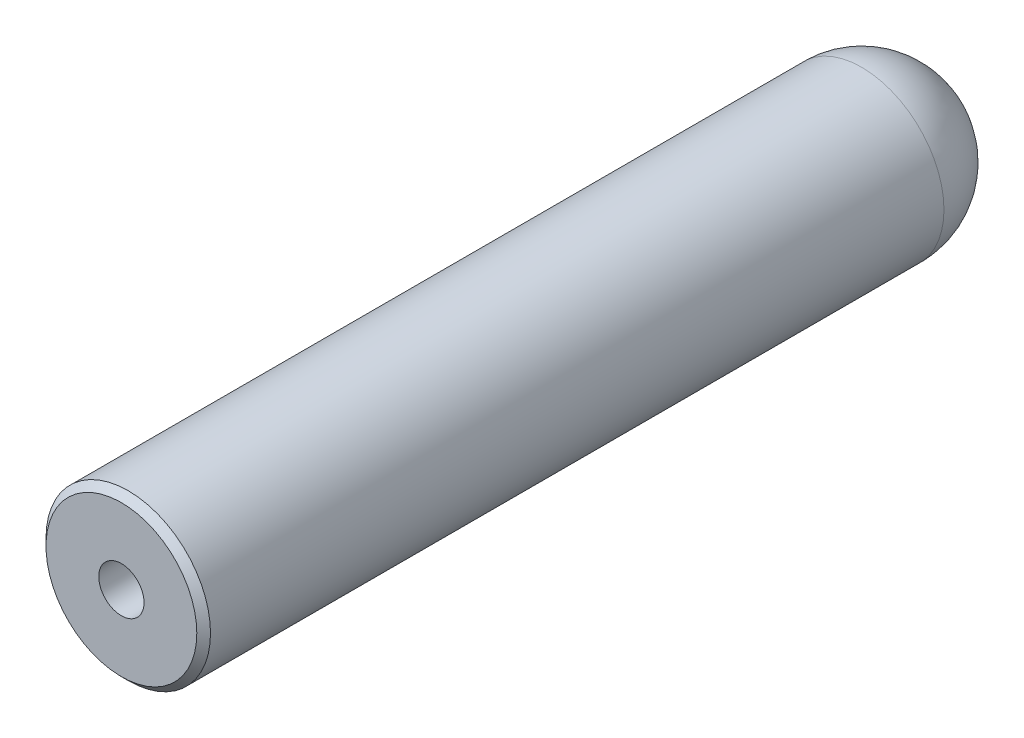
ISO-10303-21;
HEADER;
FILE_DESCRIPTION(('STEP AP214'),'2;1');
FILE_NAME('part.step','',(''),(''),'','','');
FILE_SCHEMA(('AUTOMOTIVE_DESIGN { 1 0 10303 214 1 1 1 1 }'));
ENDSEC;
DATA;
#1=APPLICATION_CONTEXT('core data for automotive mechanical design processes');
#2=APPLICATION_PROTOCOL_DEFINITION('international standard','automotive_design',2000,#1);
#3=PRODUCT_CONTEXT('',#1,'mechanical');
#4=PRODUCT('Part','Part','',(#3));
#5=PRODUCT_RELATED_PRODUCT_CATEGORY('part','',(#4));
#6=PRODUCT_DEFINITION_FORMATION('','',#4);
#7=PRODUCT_DEFINITION_CONTEXT('part definition',#1,'design');
#8=PRODUCT_DEFINITION('design','',#6,#7);
#9=PRODUCT_DEFINITION_SHAPE('','',#8);
#10=(LENGTH_UNIT() NAMED_UNIT(*) SI_UNIT(.MILLI.,.METRE.));
#11=(NAMED_UNIT(*) PLANE_ANGLE_UNIT() SI_UNIT($,.RADIAN.));
#12=(NAMED_UNIT(*) SI_UNIT($,.STERADIAN.) SOLID_ANGLE_UNIT());
#13=UNCERTAINTY_MEASURE_WITH_UNIT(LENGTH_MEASURE(1.E-05),#10,'distance_accuracy_value','');
#14=(GEOMETRIC_REPRESENTATION_CONTEXT(3) GLOBAL_UNCERTAINTY_ASSIGNED_CONTEXT((#13)) GLOBAL_UNIT_ASSIGNED_CONTEXT((#10,
#11,#12)) REPRESENTATION_CONTEXT('',''));
#15=CARTESIAN_POINT('',(0.,0.,0.));
#16=DIRECTION('',(0.,0.,1.));
#17=DIRECTION('',(1.,0.,0.));
#18=AXIS2_PLACEMENT_3D('',#15,#16,#17);
#19=CARTESIAN_POINT('',(0.,0.,60.));
#20=DIRECTION('',(0.,0.,-1.));
#21=DIRECTION('',(-1.,0.,0.));
#22=AXIS2_PLACEMENT_3D('',#19,#20,#21);
#23=CYLINDRICAL_SURFACE('',#22,6.);
#24=CARTESIAN_POINT('',(0.,0.,59.5));
#25=DIRECTION('',(0.,0.,1.));
#26=DIRECTION('',(1.,0.,0.));
#27=AXIS2_PLACEMENT_3D('',#24,#25,#26);
#28=CIRCLE('',#27,6.);
#29=CARTESIAN_POINT('',(6.,0.,59.5));
#30=VERTEX_POINT('',#29);
#31=EDGE_CURVE('E11',#30,#30,#28,.F.);
#32=ORIENTED_EDGE('',*,*,#31,.T.);
#33=EDGE_LOOP('',(#32));
#34=FACE_BOUND('',#33,.T.);
#35=CARTESIAN_POINT('',(0.,0.,6.));
#36=DIRECTION('',(0.,0.,-1.));
#37=DIRECTION('',(-1.,0.,0.));
#38=AXIS2_PLACEMENT_3D('',#35,#36,#37);
#39=CIRCLE('',#38,6.);
#40=CARTESIAN_POINT('',(-6.,0.,6.));
#41=VERTEX_POINT('',#40);
#42=EDGE_CURVE('E59',#41,#41,#39,.F.);
#43=ORIENTED_EDGE('',*,*,#42,.T.);
#44=EDGE_LOOP('',(#43));
#45=FACE_BOUND('',#44,.T.);
#46=ADVANCED_FACE('F40',(#34,#45),#23,.T.);
#47=CARTESIAN_POINT('',(0.,0.,60.));
#48=DIRECTION('',(0.,0.,1.));
#49=DIRECTION('',(1.,0.,0.));
#50=AXIS2_PLACEMENT_3D('',#47,#48,#49);
#51=PLANE('',#50);
#52=CARTESIAN_POINT('',(0.,0.,60.));
#53=DIRECTION('',(0.,0.,1.));
#54=DIRECTION('',(1.,0.,0.));
#55=AXIS2_PLACEMENT_3D('',#52,#53,#54);
#56=CIRCLE('',#55,1.64999999999999);
#57=CARTESIAN_POINT('',(1.64999999999999,0.,60.));
#58=VERTEX_POINT('',#57);
#59=EDGE_CURVE('E60',#58,#58,#56,.T.);
#60=ORIENTED_EDGE('',*,*,#59,.F.);
#61=EDGE_LOOP('',(#60));
#62=FACE_BOUND('',#61,.T.);
#63=CARTESIAN_POINT('',(0.,0.,60.));
#64=DIRECTION('',(0.,0.,1.));
#65=DIRECTION('',(1.,0.,0.));
#66=AXIS2_PLACEMENT_3D('',#63,#64,#65);
#67=CIRCLE('',#66,5.49999999999999);
#68=CARTESIAN_POINT('',(5.49999999999999,0.,60.));
#69=VERTEX_POINT('',#68);
#70=EDGE_CURVE('E47',#69,#69,#67,.T.);
#71=ORIENTED_EDGE('',*,*,#70,.T.);
#72=EDGE_LOOP('',(#71));
#73=FACE_BOUND('',#72,.T.);
#74=ADVANCED_FACE('F69',(#62,#73),#51,.T.);
#75=CARTESIAN_POINT('',(0.,0.,6.));
#76=DIRECTION('',(0.,0.,1.));
#77=DIRECTION('',(1.,0.,0.));
#78=AXIS2_PLACEMENT_3D('',#75,#76,#77);
#79=SPHERICAL_SURFACE('',#78,6.);
#80=ORIENTED_EDGE('',*,*,#42,.F.);
#81=EDGE_LOOP('',(#80));
#82=FACE_BOUND('',#81,.T.);
#83=ADVANCED_FACE('F72',(#82),#79,.T.);
#84=CARTESIAN_POINT('',(0.,0.,60.));
#85=DIRECTION('',(0.,0.,-1.));
#86=DIRECTION('',(-1.,0.,0.));
#87=AXIS2_PLACEMENT_3D('',#84,#85,#86);
#88=CONICAL_SURFACE('',#87,5.49999999999999,0.785398163397446);
#89=ORIENTED_EDGE('',*,*,#31,.F.);
#90=EDGE_LOOP('',(#89));
#91=FACE_BOUND('',#90,.T.);
#92=ORIENTED_EDGE('',*,*,#70,.F.);
#93=EDGE_LOOP('',(#92));
#94=FACE_BOUND('',#93,.T.);
#95=ADVANCED_FACE('F42',(#91,#94),#88,.T.);
#96=CARTESIAN_POINT('',(0.,0.,48.5));
#97=DIRECTION('',(0.,0.,1.));
#98=DIRECTION('',(1.,0.,0.));
#99=AXIS2_PLACEMENT_3D('',#96,#97,#98);
#100=CONICAL_SURFACE('',#99,1.64999999999999,1.02974425867665);
#101=CARTESIAN_POINT('',(0.,0.,47.5085799786045));
#102=VERTEX_POINT('',#101);
#103=VERTEX_LOOP('',#102);
#104=FACE_BOUND('',#103,.T.);
#105=CARTESIAN_POINT('',(0.,0.,48.5));
#106=DIRECTION('',(0.,0.,1.));
#107=DIRECTION('',(1.,0.,0.));
#108=AXIS2_PLACEMENT_3D('',#105,#106,#107);
#109=CIRCLE('',#108,1.64999999999999);
#110=CARTESIAN_POINT('',(1.64999999999999,0.,48.5));
#111=VERTEX_POINT('',#110);
#112=EDGE_CURVE('E57',#111,#111,#109,.T.);
#113=ORIENTED_EDGE('',*,*,#112,.T.);
#114=EDGE_LOOP('',(#113));
#115=FACE_BOUND('',#114,.T.);
#116=ADVANCED_FACE('F50',(#104,#115),#100,.F.);
#117=CARTESIAN_POINT('',(0.,0.,60.));
#118=DIRECTION('',(0.,0.,1.));
#119=DIRECTION('',(1.,0.,0.));
#120=AXIS2_PLACEMENT_3D('',#117,#118,#119);
#121=CYLINDRICAL_SURFACE('',#120,1.64999999999999);
#122=ORIENTED_EDGE('',*,*,#112,.F.);
#123=EDGE_LOOP('',(#122));
#124=FACE_BOUND('',#123,.T.);
#125=ORIENTED_EDGE('',*,*,#59,.T.);
#126=EDGE_LOOP('',(#125));
#127=FACE_BOUND('',#126,.T.);
#128=ADVANCED_FACE('F53',(#124,#127),#121,.F.);
#129=CLOSED_SHELL('',(#46,#74,#83,#95,#116,#128));
#130=MANIFOLD_SOLID_BREP('B2',#129);
#131=ADVANCED_BREP_SHAPE_REPRESENTATION('',(#18,#130),#14);
#132=SHAPE_DEFINITION_REPRESENTATION(#9,#131);
ENDSEC;
END-ISO-10303-21;
